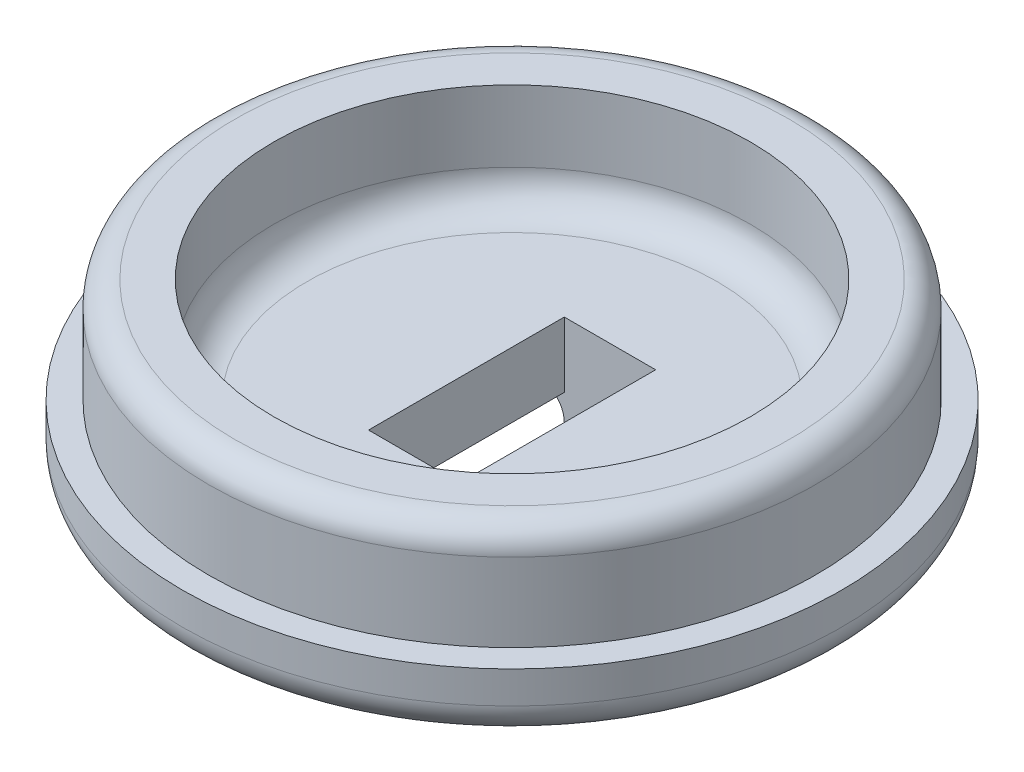
ISO-10303-21;
HEADER;
FILE_DESCRIPTION(('STEP AP214'),'2;1');
FILE_NAME('part.step','',(''),(''),'','','');
FILE_SCHEMA(('AUTOMOTIVE_DESIGN { 1 0 10303 214 1 1 1 1 }'));
ENDSEC;
DATA;
#1=APPLICATION_CONTEXT('core data for automotive mechanical design processes');
#2=APPLICATION_PROTOCOL_DEFINITION('international standard','automotive_design',2000,#1);
#3=PRODUCT_CONTEXT('',#1,'mechanical');
#4=PRODUCT('Part','Part','',(#3));
#5=PRODUCT_RELATED_PRODUCT_CATEGORY('part','',(#4));
#6=PRODUCT_DEFINITION_FORMATION('','',#4);
#7=PRODUCT_DEFINITION_CONTEXT('part definition',#1,'design');
#8=PRODUCT_DEFINITION('design','',#6,#7);
#9=PRODUCT_DEFINITION_SHAPE('','',#8);
#10=(LENGTH_UNIT() NAMED_UNIT(*) SI_UNIT(.MILLI.,.METRE.));
#11=(NAMED_UNIT(*) PLANE_ANGLE_UNIT() SI_UNIT($,.RADIAN.));
#12=(NAMED_UNIT(*) SI_UNIT($,.STERADIAN.) SOLID_ANGLE_UNIT());
#13=UNCERTAINTY_MEASURE_WITH_UNIT(LENGTH_MEASURE(1.E-05),#10,'distance_accuracy_value','');
#14=(GEOMETRIC_REPRESENTATION_CONTEXT(3) GLOBAL_UNCERTAINTY_ASSIGNED_CONTEXT((#13)) GLOBAL_UNIT_ASSIGNED_CONTEXT((#10,
#11,#12)) REPRESENTATION_CONTEXT('',''));
#15=CARTESIAN_POINT('',(0.,0.,0.));
#16=DIRECTION('',(0.,0.,1.));
#17=DIRECTION('',(1.,0.,0.));
#18=AXIS2_PLACEMENT_3D('',#15,#16,#17);
#19=CARTESIAN_POINT('',(0.,0.,0.));
#20=DIRECTION('',(0.,1.,0.));
#21=DIRECTION('',(0.,0.,1.));
#22=AXIS2_PLACEMENT_3D('',#19,#20,#21);
#23=PLANE('',#22);
#24=CARTESIAN_POINT('',(0.,0.,0.));
#25=DIRECTION('',(0.,1.,0.));
#26=DIRECTION('',(0.,0.,1.));
#27=AXIS2_PLACEMENT_3D('',#24,#25,#26);
#28=CIRCLE('',#27,22.71);
#29=CARTESIAN_POINT('',(0.,0.,22.71));
#30=VERTEX_POINT('',#29);
#31=EDGE_CURVE('E260',#30,#30,#28,.F.);
#32=ORIENTED_EDGE('',*,*,#31,.T.);
#33=EDGE_LOOP('',(#32));
#34=FACE_BOUND('',#33,.T.);
#35=DIRECTION('',(0.,0.,1.));
#36=VECTOR('',#35,1.);
#37=CARTESIAN_POINT('',(-3.5,0.,0.));
#38=LINE('',#37,#36);
#39=CARTESIAN_POINT('',(-3.5,0.,-7.5));
#40=VERTEX_POINT('',#39);
#41=CARTESIAN_POINT('',(-3.5,0.,7.5));
#42=VERTEX_POINT('',#41);
#43=EDGE_CURVE('E225',#40,#42,#38,.T.);
#44=ORIENTED_EDGE('',*,*,#43,.T.);
#45=DIRECTION('',(-1.,0.,0.));
#46=VECTOR('',#45,1.);
#47=CARTESIAN_POINT('',(0.,0.,7.5));
#48=LINE('',#47,#46);
#49=CARTESIAN_POINT('',(-5.5,0.,7.5));
#50=VERTEX_POINT('',#49);
#51=EDGE_CURVE('E68',#42,#50,#48,.T.);
#52=ORIENTED_EDGE('',*,*,#51,.T.);
#53=DIRECTION('',(0.,0.,-1.));
#54=VECTOR('',#53,1.);
#55=CARTESIAN_POINT('',(-5.5,0.,12.5));
#56=LINE('',#55,#54);
#57=CARTESIAN_POINT('',(-5.5,0.,12.5));
#58=VERTEX_POINT('',#57);
#59=EDGE_CURVE('E327',#50,#58,#56,.F.);
#60=ORIENTED_EDGE('',*,*,#59,.T.);
#61=DIRECTION('',(-1.,0.,0.));
#62=VECTOR('',#61,1.);
#63=CARTESIAN_POINT('',(3.5,0.,12.5));
#64=LINE('',#63,#62);
#65=CARTESIAN_POINT('',(5.5,0.,12.5));
#66=VERTEX_POINT('',#65);
#67=EDGE_CURVE('E283',#58,#66,#64,.F.);
#68=ORIENTED_EDGE('',*,*,#67,.T.);
#69=DIRECTION('',(0.,0.,1.));
#70=VECTOR('',#69,1.);
#71=CARTESIAN_POINT('',(5.5,0.,7.5));
#72=LINE('',#71,#70);
#73=CARTESIAN_POINT('',(5.5,0.,7.5));
#74=VERTEX_POINT('',#73);
#75=EDGE_CURVE('E315',#66,#74,#72,.F.);
#76=ORIENTED_EDGE('',*,*,#75,.T.);
#77=DIRECTION('',(-1.,0.,0.));
#78=VECTOR('',#77,1.);
#79=CARTESIAN_POINT('',(0.,0.,7.5));
#80=LINE('',#79,#78);
#81=CARTESIAN_POINT('',(3.5,0.,7.5));
#82=VERTEX_POINT('',#81);
#83=EDGE_CURVE('E313',#74,#82,#80,.T.);
#84=ORIENTED_EDGE('',*,*,#83,.T.);
#85=DIRECTION('',(0.,0.,1.));
#86=VECTOR('',#85,1.);
#87=CARTESIAN_POINT('',(3.5,0.,0.));
#88=LINE('',#87,#86);
#89=CARTESIAN_POINT('',(3.5,0.,-7.5));
#90=VERTEX_POINT('',#89);
#91=EDGE_CURVE('E227',#90,#82,#88,.T.);
#92=ORIENTED_EDGE('',*,*,#91,.F.);
#93=DIRECTION('',(1.,0.,0.));
#94=VECTOR('',#93,1.);
#95=CARTESIAN_POINT('',(0.,0.,-7.5));
#96=LINE('',#95,#94);
#97=CARTESIAN_POINT('',(5.5,0.,-7.5));
#98=VERTEX_POINT('',#97);
#99=EDGE_CURVE('E60',#90,#98,#96,.T.);
#100=ORIENTED_EDGE('',*,*,#99,.T.);
#101=DIRECTION('',(0.,0.,1.));
#102=VECTOR('',#101,1.);
#103=CARTESIAN_POINT('',(5.5,0.,-12.5));
#104=LINE('',#103,#102);
#105=CARTESIAN_POINT('',(5.5,0.,-12.5));
#106=VERTEX_POINT('',#105);
#107=EDGE_CURVE('E318',#98,#106,#104,.F.);
#108=ORIENTED_EDGE('',*,*,#107,.T.);
#109=DIRECTION('',(1.,0.,0.));
#110=VECTOR('',#109,1.);
#111=CARTESIAN_POINT('',(-3.5,0.,-12.5));
#112=LINE('',#111,#110);
#113=CARTESIAN_POINT('',(-5.5,0.,-12.5));
#114=VERTEX_POINT('',#113);
#115=EDGE_CURVE('E285',#106,#114,#112,.F.);
#116=ORIENTED_EDGE('',*,*,#115,.T.);
#117=DIRECTION('',(0.,0.,-1.));
#118=VECTOR('',#117,1.);
#119=CARTESIAN_POINT('',(-5.5,0.,-7.5));
#120=LINE('',#119,#118);
#121=CARTESIAN_POINT('',(-5.5,0.,-7.5));
#122=VERTEX_POINT('',#121);
#123=EDGE_CURVE('E324',#114,#122,#120,.F.);
#124=ORIENTED_EDGE('',*,*,#123,.T.);
#125=DIRECTION('',(1.,0.,0.));
#126=VECTOR('',#125,1.);
#127=CARTESIAN_POINT('',(0.,0.,-7.5));
#128=LINE('',#127,#126);
#129=EDGE_CURVE('E322',#122,#40,#128,.T.);
#130=ORIENTED_EDGE('',*,*,#129,.T.);
#131=EDGE_LOOP('',(#44,#52,#60,#68,#76,#84,#92,#100,#108,#116,#124,#130));
#132=FACE_BOUND('',#131,.T.);
#133=ADVANCED_FACE('F45',(#34,#132),#23,.F.);
#134=CARTESIAN_POINT('',(0.,5.,0.));
#135=DIRECTION('',(0.,1.,0.));
#136=DIRECTION('',(0.,0.,1.));
#137=AXIS2_PLACEMENT_3D('',#134,#135,#136);
#138=PLANE('',#137);
#139=CARTESIAN_POINT('',(0.,5.,0.));
#140=DIRECTION('',(0.,1.,0.));
#141=DIRECTION('',(0.,0.,1.));
#142=AXIS2_PLACEMENT_3D('',#139,#140,#141);
#143=CIRCLE('',#142,15.71);
#144=CARTESIAN_POINT('',(0.,5.,15.71));
#145=VERTEX_POINT('',#144);
#146=EDGE_CURVE('E254',#145,#145,#143,.T.);
#147=ORIENTED_EDGE('',*,*,#146,.T.);
#148=EDGE_LOOP('',(#147));
#149=FACE_BOUND('',#148,.T.);
#150=DIRECTION('',(1.,0.,0.));
#151=VECTOR('',#150,1.);
#152=CARTESIAN_POINT('',(0.,5.,7.5));
#153=LINE('',#152,#151);
#154=CARTESIAN_POINT('',(-3.5,5.,7.5));
#155=VERTEX_POINT('',#154);
#156=CARTESIAN_POINT('',(3.5,5.,7.5));
#157=VERTEX_POINT('',#156);
#158=EDGE_CURVE('E275',#155,#157,#153,.T.);
#159=ORIENTED_EDGE('',*,*,#158,.F.);
#160=DIRECTION('',(0.,0.,-1.));
#161=VECTOR('',#160,1.);
#162=CARTESIAN_POINT('',(-3.5,5.,0.));
#163=LINE('',#162,#161);
#164=CARTESIAN_POINT('',(-3.5,5.,-7.5));
#165=VERTEX_POINT('',#164);
#166=EDGE_CURVE('E277',#155,#165,#163,.T.);
#167=ORIENTED_EDGE('',*,*,#166,.T.);
#168=DIRECTION('',(1.,0.,0.));
#169=VECTOR('',#168,1.);
#170=CARTESIAN_POINT('',(0.,5.,-7.5));
#171=LINE('',#170,#169);
#172=CARTESIAN_POINT('',(3.5,5.,-7.5));
#173=VERTEX_POINT('',#172);
#174=EDGE_CURVE('E269',#165,#173,#171,.T.);
#175=ORIENTED_EDGE('',*,*,#174,.T.);
#176=DIRECTION('',(0.,0.,-1.));
#177=VECTOR('',#176,1.);
#178=CARTESIAN_POINT('',(3.5,5.,0.));
#179=LINE('',#178,#177);
#180=EDGE_CURVE('E272',#157,#173,#179,.T.);
#181=ORIENTED_EDGE('',*,*,#180,.F.);
#182=EDGE_LOOP('',(#159,#167,#175,#181));
#183=FACE_BOUND('',#182,.T.);
#184=ADVANCED_FACE('F383',(#149,#183),#138,.T.);
#185=CARTESIAN_POINT('',(0.,5.,0.));
#186=DIRECTION('',(0.,-1.,0.));
#187=DIRECTION('',(0.,0.,-1.));
#188=AXIS2_PLACEMENT_3D('',#185,#186,#187);
#189=CYLINDRICAL_SURFACE('',#188,25.25);
#190=CARTESIAN_POINT('',(0.,2.54,0.));
#191=DIRECTION('',(0.,1.,0.));
#192=DIRECTION('',(0.,0.,1.));
#193=AXIS2_PLACEMENT_3D('',#190,#191,#192);
#194=CIRCLE('',#193,25.25);
#195=CARTESIAN_POINT('',(0.,2.54,25.25));
#196=VERTEX_POINT('',#195);
#197=EDGE_CURVE('E257',#196,#196,#194,.T.);
#198=ORIENTED_EDGE('',*,*,#197,.T.);
#199=EDGE_LOOP('',(#198));
#200=FACE_BOUND('',#199,.T.);
#201=CARTESIAN_POINT('',(0.,5.,0.));
#202=DIRECTION('',(0.,1.,0.));
#203=DIRECTION('',(0.,0.,1.));
#204=AXIS2_PLACEMENT_3D('',#201,#202,#203);
#205=CIRCLE('',#204,25.25);
#206=CARTESIAN_POINT('',(0.,5.,25.25));
#207=VERTEX_POINT('',#206);
#208=EDGE_CURVE('E248',#207,#207,#205,.T.);
#209=ORIENTED_EDGE('',*,*,#208,.F.);
#210=EDGE_LOOP('',(#209));
#211=FACE_BOUND('',#210,.T.);
#212=ADVANCED_FACE('F418',(#200,#211),#189,.T.);
#213=CARTESIAN_POINT('',(0.,5.,0.));
#214=DIRECTION('',(0.,1.,0.));
#215=DIRECTION('',(0.,0.,1.));
#216=AXIS2_PLACEMENT_3D('',#213,#214,#215);
#217=CIRCLE('',#216,23.25);
#218=CARTESIAN_POINT('',(0.,5.,23.25));
#219=VERTEX_POINT('',#218);
#220=EDGE_CURVE('E245',#219,#219,#217,.T.);
#221=ORIENTED_EDGE('',*,*,#220,.F.);
#222=EDGE_LOOP('',(#221));
#223=FACE_BOUND('',#222,.T.);
#224=ORIENTED_EDGE('',*,*,#208,.T.);
#225=EDGE_LOOP('',(#224));
#226=FACE_BOUND('',#225,.T.);
#227=ADVANCED_FACE('F421',(#223,#226),#138,.T.);
#228=CARTESIAN_POINT('',(0.,13.,0.));
#229=DIRECTION('',(0.,1.,0.));
#230=DIRECTION('',(0.,0.,1.));
#231=AXIS2_PLACEMENT_3D('',#228,#229,#230);
#232=PLANE('',#231);
#233=CARTESIAN_POINT('',(0.,13.,0.));
#234=DIRECTION('',(0.,1.,0.));
#235=DIRECTION('',(0.,0.,1.));
#236=AXIS2_PLACEMENT_3D('',#233,#234,#235);
#237=CIRCLE('',#236,21.25);
#238=CARTESIAN_POINT('',(0.,13.,21.25));
#239=VERTEX_POINT('',#238);
#240=EDGE_CURVE('E263',#239,#239,#237,.T.);
#241=ORIENTED_EDGE('',*,*,#240,.T.);
#242=EDGE_LOOP('',(#241));
#243=FACE_BOUND('',#242,.T.);
#244=CARTESIAN_POINT('',(0.,13.,0.));
#245=DIRECTION('',(0.,1.,0.));
#246=DIRECTION('',(0.,0.,1.));
#247=AXIS2_PLACEMENT_3D('',#244,#245,#246);
#248=CIRCLE('',#247,18.25);
#249=CARTESIAN_POINT('',(0.,13.,18.25));
#250=VERTEX_POINT('',#249);
#251=EDGE_CURVE('E234',#250,#250,#248,.T.);
#252=ORIENTED_EDGE('',*,*,#251,.F.);
#253=EDGE_LOOP('',(#252));
#254=FACE_BOUND('',#253,.T.);
#255=ADVANCED_FACE('F522',(#243,#254),#232,.T.);
#256=CARTESIAN_POINT('',(0.,13.,0.));
#257=DIRECTION('',(0.,-1.,0.));
#258=DIRECTION('',(0.,0.,-1.));
#259=AXIS2_PLACEMENT_3D('',#256,#257,#258);
#260=CYLINDRICAL_SURFACE('',#259,23.25);
#261=CARTESIAN_POINT('',(0.,11.,0.));
#262=DIRECTION('',(0.,1.,0.));
#263=DIRECTION('',(0.,0.,1.));
#264=AXIS2_PLACEMENT_3D('',#261,#262,#263);
#265=CIRCLE('',#264,23.25);
#266=CARTESIAN_POINT('',(0.,11.,23.25));
#267=VERTEX_POINT('',#266);
#268=EDGE_CURVE('E266',#267,#267,#265,.F.);
#269=ORIENTED_EDGE('',*,*,#268,.T.);
#270=EDGE_LOOP('',(#269));
#271=FACE_BOUND('',#270,.T.);
#272=ORIENTED_EDGE('',*,*,#220,.T.);
#273=EDGE_LOOP('',(#272));
#274=FACE_BOUND('',#273,.T.);
#275=ADVANCED_FACE('F518',(#271,#274),#260,.T.);
#276=CARTESIAN_POINT('',(0.,13.,0.));
#277=DIRECTION('',(0.,-1.,0.));
#278=DIRECTION('',(0.,0.,-1.));
#279=AXIS2_PLACEMENT_3D('',#276,#277,#278);
#280=CYLINDRICAL_SURFACE('',#279,18.25);
#281=CARTESIAN_POINT('',(0.,7.54,0.));
#282=DIRECTION('',(0.,1.,0.));
#283=DIRECTION('',(0.,0.,1.));
#284=AXIS2_PLACEMENT_3D('',#281,#282,#283);
#285=CIRCLE('',#284,18.25);
#286=CARTESIAN_POINT('',(0.,7.54,18.25));
#287=VERTEX_POINT('',#286);
#288=EDGE_CURVE('E251',#287,#287,#285,.F.);
#289=ORIENTED_EDGE('',*,*,#288,.T.);
#290=EDGE_LOOP('',(#289));
#291=FACE_BOUND('',#290,.T.);
#292=ORIENTED_EDGE('',*,*,#251,.T.);
#293=EDGE_LOOP('',(#292));
#294=FACE_BOUND('',#293,.T.);
#295=ADVANCED_FACE('F431',(#291,#294),#280,.F.);
#296=CARTESIAN_POINT('',(0.,7.54,0.));
#297=DIRECTION('',(0.,1.,0.));
#298=DIRECTION('',(0.,0.,1.));
#299=AXIS2_PLACEMENT_3D('',#296,#297,#298);
#300=TOROIDAL_SURFACE('',#299,15.71,2.54);
#301=ORIENTED_EDGE('',*,*,#146,.F.);
#302=EDGE_LOOP('',(#301));
#303=FACE_BOUND('',#302,.T.);
#304=ORIENTED_EDGE('',*,*,#288,.F.);
#305=EDGE_LOOP('',(#304));
#306=FACE_BOUND('',#305,.T.);
#307=ADVANCED_FACE('F427',(#303,#306),#300,.F.);
#308=CARTESIAN_POINT('',(0.,2.54,0.));
#309=DIRECTION('',(0.,1.,0.));
#310=DIRECTION('',(0.,0.,1.));
#311=AXIS2_PLACEMENT_3D('',#308,#309,#310);
#312=TOROIDAL_SURFACE('',#311,22.71,2.54);
#313=ORIENTED_EDGE('',*,*,#31,.F.);
#314=EDGE_LOOP('',(#313));
#315=FACE_BOUND('',#314,.T.);
#316=ORIENTED_EDGE('',*,*,#197,.F.);
#317=EDGE_LOOP('',(#316));
#318=FACE_BOUND('',#317,.T.);
#319=ADVANCED_FACE('F430',(#315,#318),#312,.T.);
#320=CARTESIAN_POINT('',(0.,11.,0.));
#321=DIRECTION('',(0.,1.,0.));
#322=DIRECTION('',(0.,0.,1.));
#323=AXIS2_PLACEMENT_3D('',#320,#321,#322);
#324=TOROIDAL_SURFACE('',#323,21.25,2.);
#325=ORIENTED_EDGE('',*,*,#268,.F.);
#326=EDGE_LOOP('',(#325));
#327=FACE_BOUND('',#326,.T.);
#328=ORIENTED_EDGE('',*,*,#240,.F.);
#329=EDGE_LOOP('',(#328));
#330=FACE_BOUND('',#329,.T.);
#331=ADVANCED_FACE('F435',(#327,#330),#324,.T.);
#332=CARTESIAN_POINT('',(-3.5,13.,0.));
#333=DIRECTION('',(1.,0.,0.));
#334=DIRECTION('',(0.,0.,-1.));
#335=AXIS2_PLACEMENT_3D('',#332,#333,#334);
#336=PLANE('',#335);
#337=DIRECTION('',(0.,-1.,0.));
#338=VECTOR('',#337,1.);
#339=CARTESIAN_POINT('',(-3.5,13.,7.5));
#340=LINE('',#339,#338);
#341=EDGE_CURVE('E231',#155,#42,#340,.T.);
#342=ORIENTED_EDGE('',*,*,#341,.T.);
#343=ORIENTED_EDGE('',*,*,#43,.F.);
#344=DIRECTION('',(0.,-1.,0.));
#345=VECTOR('',#344,1.);
#346=CARTESIAN_POINT('',(-3.5,13.,-7.5));
#347=LINE('',#346,#345);
#348=EDGE_CURVE('E230',#165,#40,#347,.T.);
#349=ORIENTED_EDGE('',*,*,#348,.F.);
#350=ORIENTED_EDGE('',*,*,#166,.F.);
#351=EDGE_LOOP('',(#342,#343,#349,#350));
#352=FACE_BOUND('',#351,.T.);
#353=ADVANCED_FACE('F381',(#352),#336,.T.);
#354=CARTESIAN_POINT('',(0.,13.,7.5));
#355=DIRECTION('',(0.,0.,1.));
#356=DIRECTION('',(1.,0.,0.));
#357=AXIS2_PLACEMENT_3D('',#354,#355,#356);
#358=PLANE('',#357);
#359=DIRECTION('',(0.,1.,0.));
#360=VECTOR('',#359,1.);
#361=CARTESIAN_POINT('',(3.5,-4.,7.5));
#362=LINE('',#361,#360);
#363=CARTESIAN_POINT('',(3.5,-3.,7.5));
#364=VERTEX_POINT('',#363);
#365=CARTESIAN_POINT('',(3.5,-2.,7.5));
#366=VERTEX_POINT('',#365);
#367=EDGE_CURVE('E207',#364,#366,#362,.T.);
#368=ORIENTED_EDGE('',*,*,#367,.F.);
#369=DIRECTION('',(1.,0.,0.));
#370=VECTOR('',#369,1.);
#371=CARTESIAN_POINT('',(-3.5,-3.,7.5));
#372=LINE('',#371,#370);
#373=CARTESIAN_POINT('',(-3.5,-3.,7.5));
#374=VERTEX_POINT('',#373);
#375=EDGE_CURVE('E295',#364,#374,#372,.F.);
#376=ORIENTED_EDGE('',*,*,#375,.T.);
#377=DIRECTION('',(0.,1.,0.));
#378=VECTOR('',#377,1.);
#379=CARTESIAN_POINT('',(-3.5,-4.,7.5));
#380=LINE('',#379,#378);
#381=CARTESIAN_POINT('',(-3.5,-2.,7.5));
#382=VERTEX_POINT('',#381);
#383=EDGE_CURVE('E211',#374,#382,#380,.T.);
#384=ORIENTED_EDGE('',*,*,#383,.T.);
#385=CARTESIAN_POINT('',(-5.5,-2.,7.5));
#386=DIRECTION('',(0.,0.,1.));
#387=DIRECTION('',(1.,0.,0.));
#388=AXIS2_PLACEMENT_3D('',#385,#386,#387);
#389=CIRCLE('',#388,2.);
#390=EDGE_CURVE('E335',#382,#50,#389,.T.);
#391=ORIENTED_EDGE('',*,*,#390,.T.);
#392=ORIENTED_EDGE('',*,*,#51,.F.);
#393=ORIENTED_EDGE('',*,*,#341,.F.);
#394=ORIENTED_EDGE('',*,*,#158,.T.);
#395=DIRECTION('',(0.,-1.,0.));
#396=VECTOR('',#395,1.);
#397=CARTESIAN_POINT('',(3.5,13.,7.5));
#398=LINE('',#397,#396);
#399=EDGE_CURVE('E235',#157,#82,#398,.T.);
#400=ORIENTED_EDGE('',*,*,#399,.T.);
#401=ORIENTED_EDGE('',*,*,#83,.F.);
#402=CARTESIAN_POINT('',(5.5,-2.,7.5));
#403=DIRECTION('',(0.,0.,1.));
#404=DIRECTION('',(1.,0.,0.));
#405=AXIS2_PLACEMENT_3D('',#402,#403,#404);
#406=CIRCLE('',#405,2.);
#407=EDGE_CURVE('E11',#74,#366,#406,.T.);
#408=ORIENTED_EDGE('',*,*,#407,.T.);
#409=EDGE_LOOP('',(#368,#376,#384,#391,#392,#393,#394,#400,#401,#408));
#410=FACE_BOUND('',#409,.T.);
#411=ADVANCED_FACE('F385',(#410),#358,.F.);
#412=CARTESIAN_POINT('',(3.5,13.,0.));
#413=DIRECTION('',(1.,0.,0.));
#414=DIRECTION('',(0.,0.,-1.));
#415=AXIS2_PLACEMENT_3D('',#412,#413,#414);
#416=PLANE('',#415);
#417=ORIENTED_EDGE('',*,*,#180,.T.);
#418=DIRECTION('',(0.,-1.,0.));
#419=VECTOR('',#418,1.);
#420=CARTESIAN_POINT('',(3.5,13.,-7.5));
#421=LINE('',#420,#419);
#422=EDGE_CURVE('E238',#173,#90,#421,.T.);
#423=ORIENTED_EDGE('',*,*,#422,.T.);
#424=ORIENTED_EDGE('',*,*,#91,.T.);
#425=ORIENTED_EDGE('',*,*,#399,.F.);
#426=EDGE_LOOP('',(#417,#423,#424,#425));
#427=FACE_BOUND('',#426,.T.);
#428=ADVANCED_FACE('F375',(#427),#416,.F.);
#429=CARTESIAN_POINT('',(0.,13.,-7.5));
#430=DIRECTION('',(0.,0.,1.));
#431=DIRECTION('',(1.,0.,0.));
#432=AXIS2_PLACEMENT_3D('',#429,#430,#431);
#433=PLANE('',#432);
#434=DIRECTION('',(0.,1.,0.));
#435=VECTOR('',#434,1.);
#436=CARTESIAN_POINT('',(-3.5,-4.,-7.5));
#437=LINE('',#436,#435);
#438=CARTESIAN_POINT('',(-3.5,-3.,-7.5));
#439=VERTEX_POINT('',#438);
#440=CARTESIAN_POINT('',(-3.5,-2.,-7.5));
#441=VERTEX_POINT('',#440);
#442=EDGE_CURVE('E219',#439,#441,#437,.T.);
#443=ORIENTED_EDGE('',*,*,#442,.F.);
#444=DIRECTION('',(-1.,0.,0.));
#445=VECTOR('',#444,1.);
#446=CARTESIAN_POINT('',(0.,-3.,-7.5));
#447=LINE('',#446,#445);
#448=CARTESIAN_POINT('',(3.5,-3.,-7.5));
#449=VERTEX_POINT('',#448);
#450=EDGE_CURVE('E297',#439,#449,#447,.F.);
#451=ORIENTED_EDGE('',*,*,#450,.T.);
#452=DIRECTION('',(0.,1.,0.));
#453=VECTOR('',#452,1.);
#454=CARTESIAN_POINT('',(3.5,-4.,-7.5));
#455=LINE('',#454,#453);
#456=CARTESIAN_POINT('',(3.5,-2.,-7.5));
#457=VERTEX_POINT('',#456);
#458=EDGE_CURVE('E222',#449,#457,#455,.T.);
#459=ORIENTED_EDGE('',*,*,#458,.T.);
#460=CARTESIAN_POINT('',(5.5,-2.,-7.5));
#461=DIRECTION('',(0.,0.,1.));
#462=DIRECTION('',(1.,0.,0.));
#463=AXIS2_PLACEMENT_3D('',#460,#461,#462);
#464=CIRCLE('',#463,2.);
#465=EDGE_CURVE('E344',#457,#98,#464,.F.);
#466=ORIENTED_EDGE('',*,*,#465,.T.);
#467=ORIENTED_EDGE('',*,*,#99,.F.);
#468=ORIENTED_EDGE('',*,*,#422,.F.);
#469=ORIENTED_EDGE('',*,*,#174,.F.);
#470=ORIENTED_EDGE('',*,*,#348,.T.);
#471=ORIENTED_EDGE('',*,*,#129,.F.);
#472=CARTESIAN_POINT('',(-5.5,-2.,-7.5));
#473=DIRECTION('',(0.,0.,1.));
#474=DIRECTION('',(1.,0.,0.));
#475=AXIS2_PLACEMENT_3D('',#472,#473,#474);
#476=CIRCLE('',#475,2.);
#477=EDGE_CURVE('E342',#122,#441,#476,.F.);
#478=ORIENTED_EDGE('',*,*,#477,.T.);
#479=EDGE_LOOP('',(#443,#451,#459,#466,#467,#468,#469,#470,#471,#478));
#480=FACE_BOUND('',#479,.T.);
#481=ADVANCED_FACE('F372',(#480),#433,.T.);
#482=CARTESIAN_POINT('',(3.5,-4.,-7.5));
#483=DIRECTION('',(-1.,0.,0.));
#484=DIRECTION('',(0.,0.,1.));
#485=AXIS2_PLACEMENT_3D('',#482,#483,#484);
#486=PLANE('',#485);
#487=DIRECTION('',(0.,1.,0.));
#488=VECTOR('',#487,1.);
#489=CARTESIAN_POINT('',(3.5,-4.,-10.5));
#490=LINE('',#489,#488);
#491=CARTESIAN_POINT('',(3.5,-6.,-10.5));
#492=VERTEX_POINT('',#491);
#493=CARTESIAN_POINT('',(3.5,-2.,-10.5));
#494=VERTEX_POINT('',#493);
#495=EDGE_CURVE('E183',#492,#494,#490,.T.);
#496=ORIENTED_EDGE('',*,*,#495,.T.);
#497=DIRECTION('',(0.,0.,1.));
#498=VECTOR('',#497,1.);
#499=CARTESIAN_POINT('',(3.5,-2.,-7.5));
#500=LINE('',#499,#498);
#501=EDGE_CURVE('E332',#494,#457,#500,.T.);
#502=ORIENTED_EDGE('',*,*,#501,.T.);
#503=ORIENTED_EDGE('',*,*,#458,.F.);
#504=CARTESIAN_POINT('',(3.5,-3.,-6.5));
#505=DIRECTION('',(-1.,0.,0.));
#506=DIRECTION('',(0.,0.,1.));
#507=AXIS2_PLACEMENT_3D('',#504,#505,#506);
#508=CIRCLE('',#507,1.);
#509=CARTESIAN_POINT('',(3.5,-4.,-6.5));
#510=VERTEX_POINT('',#509);
#511=EDGE_CURVE('E305',#449,#510,#508,.T.);
#512=ORIENTED_EDGE('',*,*,#511,.T.);
#513=DIRECTION('',(0.,0.,1.));
#514=VECTOR('',#513,1.);
#515=CARTESIAN_POINT('',(3.5,-4.,-10.5));
#516=LINE('',#515,#514);
#517=CARTESIAN_POINT('',(3.5,-4.,6.5));
#518=VERTEX_POINT('',#517);
#519=EDGE_CURVE('E202',#510,#518,#516,.T.);
#520=ORIENTED_EDGE('',*,*,#519,.T.);
#521=CARTESIAN_POINT('',(3.5,-3.,6.5));
#522=DIRECTION('',(-1.,0.,0.));
#523=DIRECTION('',(0.,0.,1.));
#524=AXIS2_PLACEMENT_3D('',#521,#522,#523);
#525=CIRCLE('',#524,1.);
#526=EDGE_CURVE('E299',#518,#364,#525,.T.);
#527=ORIENTED_EDGE('',*,*,#526,.T.);
#528=ORIENTED_EDGE('',*,*,#367,.T.);
#529=DIRECTION('',(0.,0.,1.));
#530=VECTOR('',#529,1.);
#531=CARTESIAN_POINT('',(3.5,-2.,12.5));
#532=LINE('',#531,#530);
#533=CARTESIAN_POINT('',(3.5,-2.,10.5));
#534=VERTEX_POINT('',#533);
#535=EDGE_CURVE('E179',#366,#534,#532,.T.);
#536=ORIENTED_EDGE('',*,*,#535,.T.);
#537=DIRECTION('',(0.,1.,0.));
#538=VECTOR('',#537,1.);
#539=CARTESIAN_POINT('',(3.5,-4.,10.5));
#540=LINE('',#539,#538);
#541=CARTESIAN_POINT('',(3.5,-6.,10.5));
#542=VERTEX_POINT('',#541);
#543=EDGE_CURVE('E171',#542,#534,#540,.T.);
#544=ORIENTED_EDGE('',*,*,#543,.F.);
#545=DIRECTION('',(0.,0.,1.));
#546=VECTOR('',#545,1.);
#547=CARTESIAN_POINT('',(3.5,-6.,-10.5));
#548=LINE('',#547,#546);
#549=EDGE_CURVE('E176',#492,#542,#548,.T.);
#550=ORIENTED_EDGE('',*,*,#549,.F.);
#551=EDGE_LOOP('',(#496,#502,#503,#512,#520,#527,#528,#536,#544,#550));
#552=FACE_BOUND('',#551,.T.);
#553=ADVANCED_FACE('F174',(#552),#486,.F.);
#554=CARTESIAN_POINT('',(-3.5,-4.,-7.5));
#555=DIRECTION('',(1.,0.,0.));
#556=DIRECTION('',(0.,0.,-1.));
#557=AXIS2_PLACEMENT_3D('',#554,#555,#556);
#558=PLANE('',#557);
#559=DIRECTION('',(0.,1.,0.));
#560=VECTOR('',#559,1.);
#561=CARTESIAN_POINT('',(-3.5,-4.,10.5));
#562=LINE('',#561,#560);
#563=CARTESIAN_POINT('',(-3.5,-6.,10.5));
#564=VERTEX_POINT('',#563);
#565=CARTESIAN_POINT('',(-3.5,-2.,10.5));
#566=VERTEX_POINT('',#565);
#567=EDGE_CURVE('E184',#564,#566,#562,.T.);
#568=ORIENTED_EDGE('',*,*,#567,.T.);
#569=DIRECTION('',(0.,0.,-1.));
#570=VECTOR('',#569,1.);
#571=CARTESIAN_POINT('',(-3.5,-2.,7.5));
#572=LINE('',#571,#570);
#573=EDGE_CURVE('E310',#566,#382,#572,.T.);
#574=ORIENTED_EDGE('',*,*,#573,.T.);
#575=ORIENTED_EDGE('',*,*,#383,.F.);
#576=CARTESIAN_POINT('',(-3.5,-3.,6.5));
#577=DIRECTION('',(1.,0.,0.));
#578=DIRECTION('',(0.,0.,-1.));
#579=AXIS2_PLACEMENT_3D('',#576,#577,#578);
#580=CIRCLE('',#579,1.);
#581=CARTESIAN_POINT('',(-3.5,-4.,6.5));
#582=VERTEX_POINT('',#581);
#583=EDGE_CURVE('E301',#374,#582,#580,.T.);
#584=ORIENTED_EDGE('',*,*,#583,.T.);
#585=DIRECTION('',(0.,0.,-1.));
#586=VECTOR('',#585,1.);
#587=CARTESIAN_POINT('',(-3.5,-4.,-10.5));
#588=LINE('',#587,#586);
#589=CARTESIAN_POINT('',(-3.5,-4.,-6.5));
#590=VERTEX_POINT('',#589);
#591=EDGE_CURVE('E199',#582,#590,#588,.T.);
#592=ORIENTED_EDGE('',*,*,#591,.T.);
#593=CARTESIAN_POINT('',(-3.5,-3.,-6.5));
#594=DIRECTION('',(1.,0.,0.));
#595=DIRECTION('',(0.,0.,-1.));
#596=AXIS2_PLACEMENT_3D('',#593,#594,#595);
#597=CIRCLE('',#596,1.);
#598=EDGE_CURVE('E303',#590,#439,#597,.T.);
#599=ORIENTED_EDGE('',*,*,#598,.T.);
#600=ORIENTED_EDGE('',*,*,#442,.T.);
#601=DIRECTION('',(0.,0.,-1.));
#602=VECTOR('',#601,1.);
#603=CARTESIAN_POINT('',(-3.5,-2.,-12.5));
#604=LINE('',#603,#602);
#605=CARTESIAN_POINT('',(-3.5,-2.,-10.5));
#606=VERTEX_POINT('',#605);
#607=EDGE_CURVE('E307',#441,#606,#604,.T.);
#608=ORIENTED_EDGE('',*,*,#607,.T.);
#609=DIRECTION('',(0.,1.,0.));
#610=VECTOR('',#609,1.);
#611=CARTESIAN_POINT('',(-3.5,-4.,-10.5));
#612=LINE('',#611,#610);
#613=CARTESIAN_POINT('',(-3.5,-6.,-10.5));
#614=VERTEX_POINT('',#613);
#615=EDGE_CURVE('E216',#614,#606,#612,.T.);
#616=ORIENTED_EDGE('',*,*,#615,.F.);
#617=DIRECTION('',(0.,0.,-1.));
#618=VECTOR('',#617,1.);
#619=CARTESIAN_POINT('',(-3.5,-6.,-10.5));
#620=LINE('',#619,#618);
#621=EDGE_CURVE('E193',#564,#614,#620,.T.);
#622=ORIENTED_EDGE('',*,*,#621,.F.);
#623=EDGE_LOOP('',(#568,#574,#575,#584,#592,#599,#600,#608,#616,#622));
#624=FACE_BOUND('',#623,.T.);
#625=ADVANCED_FACE('F360',(#624),#558,.F.);
#626=CARTESIAN_POINT('',(3.5,-4.,-10.5));
#627=DIRECTION('',(0.,0.,1.));
#628=DIRECTION('',(1.,0.,0.));
#629=AXIS2_PLACEMENT_3D('',#626,#627,#628);
#630=PLANE('',#629);
#631=ORIENTED_EDGE('',*,*,#615,.T.);
#632=DIRECTION('',(1.,0.,0.));
#633=VECTOR('',#632,1.);
#634=CARTESIAN_POINT('',(3.5,-2.,-10.5));
#635=LINE('',#634,#633);
#636=EDGE_CURVE('E280',#606,#494,#635,.T.);
#637=ORIENTED_EDGE('',*,*,#636,.T.);
#638=ORIENTED_EDGE('',*,*,#495,.F.);
#639=DIRECTION('',(1.,0.,0.));
#640=VECTOR('',#639,1.);
#641=CARTESIAN_POINT('',(3.5,-6.,-10.5));
#642=LINE('',#641,#640);
#643=EDGE_CURVE('E198',#614,#492,#642,.T.);
#644=ORIENTED_EDGE('',*,*,#643,.F.);
#645=EDGE_LOOP('',(#631,#637,#638,#644));
#646=FACE_BOUND('',#645,.T.);
#647=ADVANCED_FACE('F363',(#646),#630,.F.);
#648=CARTESIAN_POINT('',(3.5,-4.,10.5));
#649=DIRECTION('',(0.,0.,-1.));
#650=DIRECTION('',(-1.,0.,0.));
#651=AXIS2_PLACEMENT_3D('',#648,#649,#650);
#652=PLANE('',#651);
#653=ORIENTED_EDGE('',*,*,#543,.T.);
#654=DIRECTION('',(-1.,0.,0.));
#655=VECTOR('',#654,1.);
#656=CARTESIAN_POINT('',(-3.5,-2.,10.5));
#657=LINE('',#656,#655);
#658=EDGE_CURVE('E287',#534,#566,#657,.T.);
#659=ORIENTED_EDGE('',*,*,#658,.T.);
#660=ORIENTED_EDGE('',*,*,#567,.F.);
#661=DIRECTION('',(-1.,0.,0.));
#662=VECTOR('',#661,1.);
#663=CARTESIAN_POINT('',(3.5,-6.,10.5));
#664=LINE('',#663,#662);
#665=EDGE_CURVE('E187',#542,#564,#664,.T.);
#666=ORIENTED_EDGE('',*,*,#665,.F.);
#667=EDGE_LOOP('',(#653,#659,#660,#666));
#668=FACE_BOUND('',#667,.T.);
#669=ADVANCED_FACE('F188',(#668),#652,.F.);
#670=CARTESIAN_POINT('',(0.,-4.,0.));
#671=DIRECTION('',(0.,-1.,0.));
#672=DIRECTION('',(0.,0.,-1.));
#673=AXIS2_PLACEMENT_3D('',#670,#671,#672);
#674=PLANE('',#673);
#675=ORIENTED_EDGE('',*,*,#591,.F.);
#676=DIRECTION('',(1.,0.,0.));
#677=VECTOR('',#676,1.);
#678=CARTESIAN_POINT('',(3.5,-4.,6.5));
#679=LINE('',#678,#677);
#680=EDGE_CURVE('E292',#582,#518,#679,.T.);
#681=ORIENTED_EDGE('',*,*,#680,.T.);
#682=ORIENTED_EDGE('',*,*,#519,.F.);
#683=DIRECTION('',(-1.,0.,0.));
#684=VECTOR('',#683,1.);
#685=CARTESIAN_POINT('',(0.,-4.,-6.5));
#686=LINE('',#685,#684);
#687=EDGE_CURVE('E289',#510,#590,#686,.T.);
#688=ORIENTED_EDGE('',*,*,#687,.T.);
#689=EDGE_LOOP('',(#675,#681,#682,#688));
#690=FACE_BOUND('',#689,.T.);
#691=ADVANCED_FACE('F394',(#690),#674,.F.);
#692=CARTESIAN_POINT('',(0.,-6.,0.));
#693=DIRECTION('',(0.,-1.,0.));
#694=DIRECTION('',(0.,0.,-1.));
#695=AXIS2_PLACEMENT_3D('',#692,#693,#694);
#696=PLANE('',#695);
#697=ORIENTED_EDGE('',*,*,#549,.T.);
#698=ORIENTED_EDGE('',*,*,#665,.T.);
#699=ORIENTED_EDGE('',*,*,#621,.T.);
#700=ORIENTED_EDGE('',*,*,#643,.T.);
#701=EDGE_LOOP('',(#697,#698,#699,#700));
#702=FACE_BOUND('',#701,.T.);
#703=ADVANCED_FACE('F196',(#702),#696,.T.);
#704=CARTESIAN_POINT('',(3.5,-2.,-12.5));
#705=DIRECTION('',(-1.,0.,0.));
#706=DIRECTION('',(0.,0.,1.));
#707=AXIS2_PLACEMENT_3D('',#704,#705,#706);
#708=CYLINDRICAL_SURFACE('',#707,2.);
#709=ORIENTED_EDGE('',*,*,#636,.F.);
#710=CARTESIAN_POINT('',(-5.5,-2.,-12.5));
#711=DIRECTION('',(-0.707106781186547,0.,0.707106781186547));
#712=DIRECTION('',(-0.707106781186547,0.,-0.707106781186547));
#713=AXIS2_PLACEMENT_3D('',#710,#711,#712);
#714=ELLIPSE('',#713,2.82842712474619,2.);
#715=EDGE_CURVE('E339',#606,#114,#714,.T.);
#716=ORIENTED_EDGE('',*,*,#715,.T.);
#717=ORIENTED_EDGE('',*,*,#115,.F.);
#718=CARTESIAN_POINT('',(5.5,-2.,-12.5));
#719=DIRECTION('',(-0.707106781186547,0.,-0.707106781186547));
#720=DIRECTION('',(-0.707106781186547,0.,0.707106781186547));
#721=AXIS2_PLACEMENT_3D('',#718,#719,#720);
#722=ELLIPSE('',#721,2.82842712474619,2.);
#723=EDGE_CURVE('E346',#106,#494,#722,.F.);
#724=ORIENTED_EDGE('',*,*,#723,.T.);
#725=EDGE_LOOP('',(#709,#716,#717,#724));
#726=FACE_BOUND('',#725,.T.);
#727=ADVANCED_FACE('F440',(#726),#708,.F.);
#728=CARTESIAN_POINT('',(3.5,-2.,12.5));
#729=DIRECTION('',(1.,0.,0.));
#730=DIRECTION('',(0.,0.,-1.));
#731=AXIS2_PLACEMENT_3D('',#728,#729,#730);
#732=CYLINDRICAL_SURFACE('',#731,2.);
#733=ORIENTED_EDGE('',*,*,#658,.F.);
#734=CARTESIAN_POINT('',(5.5,-2.,12.5));
#735=DIRECTION('',(0.707106781186547,0.,-0.707106781186547));
#736=DIRECTION('',(0.707106781186547,0.,0.707106781186547));
#737=AXIS2_PLACEMENT_3D('',#734,#735,#736);
#738=ELLIPSE('',#737,2.82842712474619,2.);
#739=EDGE_CURVE('E53',#534,#66,#738,.T.);
#740=ORIENTED_EDGE('',*,*,#739,.T.);
#741=ORIENTED_EDGE('',*,*,#67,.F.);
#742=CARTESIAN_POINT('',(-5.5,-2.,12.5));
#743=DIRECTION('',(0.707106781186547,0.,0.707106781186547));
#744=DIRECTION('',(0.707106781186547,0.,-0.707106781186547));
#745=AXIS2_PLACEMENT_3D('',#742,#743,#744);
#746=ELLIPSE('',#745,2.82842712474619,2.);
#747=EDGE_CURVE('E337',#58,#566,#746,.F.);
#748=ORIENTED_EDGE('',*,*,#747,.T.);
#749=EDGE_LOOP('',(#733,#740,#741,#748));
#750=FACE_BOUND('',#749,.T.);
#751=ADVANCED_FACE('F350',(#750),#732,.F.);
#752=CARTESIAN_POINT('',(0.,-3.,6.5));
#753=DIRECTION('',(-1.,0.,0.));
#754=DIRECTION('',(0.,0.,1.));
#755=AXIS2_PLACEMENT_3D('',#752,#753,#754);
#756=CYLINDRICAL_SURFACE('',#755,1.);
#757=ORIENTED_EDGE('',*,*,#583,.F.);
#758=ORIENTED_EDGE('',*,*,#375,.F.);
#759=ORIENTED_EDGE('',*,*,#526,.F.);
#760=ORIENTED_EDGE('',*,*,#680,.F.);
#761=EDGE_LOOP('',(#757,#758,#759,#760));
#762=FACE_BOUND('',#761,.T.);
#763=ADVANCED_FACE('F391',(#762),#756,.F.);
#764=CARTESIAN_POINT('',(0.,-3.,-6.5));
#765=DIRECTION('',(-1.,0.,0.));
#766=DIRECTION('',(0.,0.,1.));
#767=AXIS2_PLACEMENT_3D('',#764,#765,#766);
#768=CYLINDRICAL_SURFACE('',#767,1.);
#769=ORIENTED_EDGE('',*,*,#511,.F.);
#770=ORIENTED_EDGE('',*,*,#450,.F.);
#771=ORIENTED_EDGE('',*,*,#598,.F.);
#772=ORIENTED_EDGE('',*,*,#687,.F.);
#773=EDGE_LOOP('',(#769,#770,#771,#772));
#774=FACE_BOUND('',#773,.T.);
#775=ADVANCED_FACE('F401',(#774),#768,.F.);
#776=CARTESIAN_POINT('',(-5.5,-2.,-7.5));
#777=DIRECTION('',(0.,0.,1.));
#778=DIRECTION('',(1.,0.,0.));
#779=AXIS2_PLACEMENT_3D('',#776,#777,#778);
#780=CYLINDRICAL_SURFACE('',#779,2.);
#781=ORIENTED_EDGE('',*,*,#747,.F.);
#782=ORIENTED_EDGE('',*,*,#59,.F.);
#783=ORIENTED_EDGE('',*,*,#390,.F.);
#784=ORIENTED_EDGE('',*,*,#573,.F.);
#785=EDGE_LOOP('',(#781,#782,#783,#784));
#786=FACE_BOUND('',#785,.T.);
#787=ADVANCED_FACE('F358',(#786),#780,.F.);
#788=CARTESIAN_POINT('',(-5.5,-2.,-7.5));
#789=DIRECTION('',(0.,0.,1.));
#790=DIRECTION('',(1.,0.,0.));
#791=AXIS2_PLACEMENT_3D('',#788,#789,#790);
#792=CYLINDRICAL_SURFACE('',#791,2.);
#793=ORIENTED_EDGE('',*,*,#477,.F.);
#794=ORIENTED_EDGE('',*,*,#123,.F.);
#795=ORIENTED_EDGE('',*,*,#715,.F.);
#796=ORIENTED_EDGE('',*,*,#607,.F.);
#797=EDGE_LOOP('',(#793,#794,#795,#796));
#798=FACE_BOUND('',#797,.T.);
#799=ADVANCED_FACE('F409',(#798),#792,.F.);
#800=CARTESIAN_POINT('',(5.5,-2.,-7.5));
#801=DIRECTION('',(0.,0.,-1.));
#802=DIRECTION('',(-1.,0.,0.));
#803=AXIS2_PLACEMENT_3D('',#800,#801,#802);
#804=CYLINDRICAL_SURFACE('',#803,2.);
#805=ORIENTED_EDGE('',*,*,#723,.F.);
#806=ORIENTED_EDGE('',*,*,#107,.F.);
#807=ORIENTED_EDGE('',*,*,#465,.F.);
#808=ORIENTED_EDGE('',*,*,#501,.F.);
#809=EDGE_LOOP('',(#805,#806,#807,#808));
#810=FACE_BOUND('',#809,.T.);
#811=ADVANCED_FACE('F369',(#810),#804,.F.);
#812=CARTESIAN_POINT('',(5.5,-2.,-7.5));
#813=DIRECTION('',(0.,0.,-1.));
#814=DIRECTION('',(-1.,0.,0.));
#815=AXIS2_PLACEMENT_3D('',#812,#813,#814);
#816=CYLINDRICAL_SURFACE('',#815,2.);
#817=ORIENTED_EDGE('',*,*,#407,.F.);
#818=ORIENTED_EDGE('',*,*,#75,.F.);
#819=ORIENTED_EDGE('',*,*,#739,.F.);
#820=ORIENTED_EDGE('',*,*,#535,.F.);
#821=EDGE_LOOP('',(#817,#818,#819,#820));
#822=FACE_BOUND('',#821,.T.);
#823=ADVANCED_FACE('F47',(#822),#816,.F.);
#824=CLOSED_SHELL('',(#133,#184,#212,#227,#255,#275,#295,#307,#319,#331,#353,#411,#428,#481,
#553,#625,#647,#669,#691,#703,#727,#751,#763,#775,#787,#799,#811,#823));
#825=MANIFOLD_SOLID_BREP('B2',#824);
#826=ADVANCED_BREP_SHAPE_REPRESENTATION('',(#18,#825),#14);
#827=SHAPE_DEFINITION_REPRESENTATION(#9,#826);
ENDSEC;
END-ISO-10303-21;
